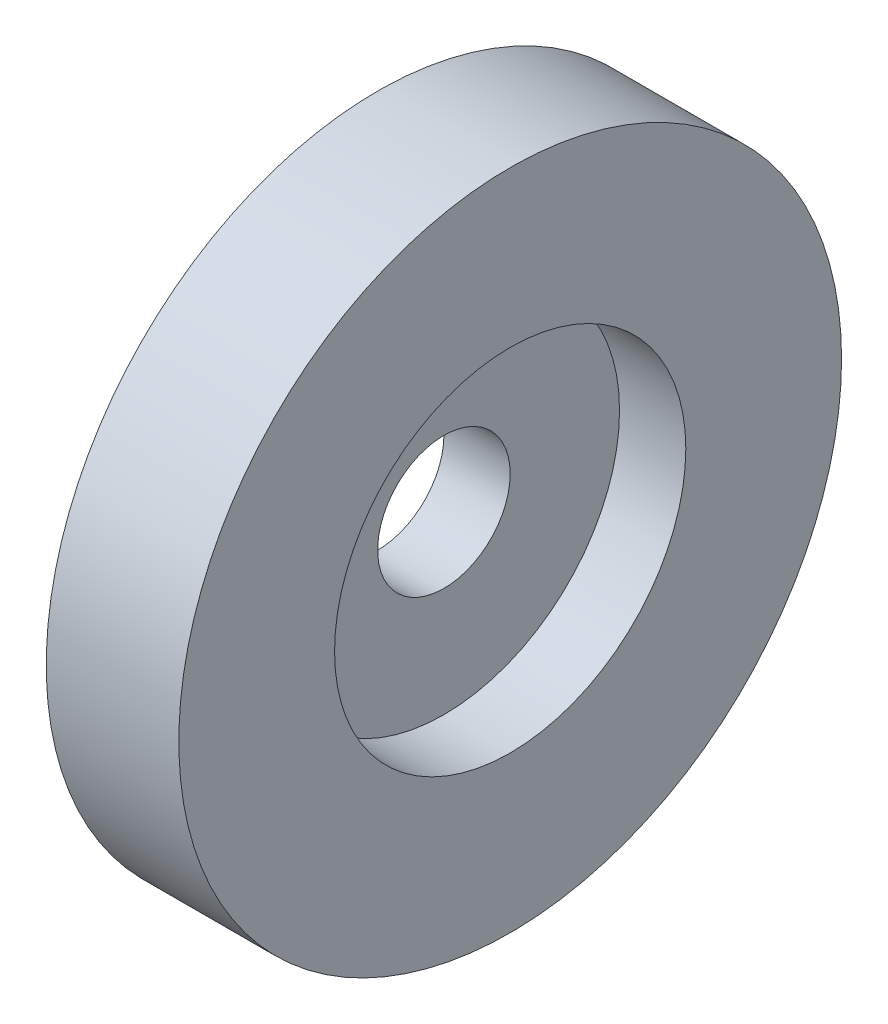
ISO-10303-21;
HEADER;
FILE_DESCRIPTION(('STEP AP214'),'2;1');
FILE_NAME('part.step','',(''),(''),'','','');
FILE_SCHEMA(('AUTOMOTIVE_DESIGN { 1 0 10303 214 1 1 1 1 }'));
ENDSEC;
DATA;
#1=APPLICATION_CONTEXT('core data for automotive mechanical design processes');
#2=APPLICATION_PROTOCOL_DEFINITION('international standard','automotive_design',2000,#1);
#3=PRODUCT_CONTEXT('',#1,'mechanical');
#4=PRODUCT('Part','Part','',(#3));
#5=PRODUCT_RELATED_PRODUCT_CATEGORY('part','',(#4));
#6=PRODUCT_DEFINITION_FORMATION('','',#4);
#7=PRODUCT_DEFINITION_CONTEXT('part definition',#1,'design');
#8=PRODUCT_DEFINITION('design','',#6,#7);
#9=PRODUCT_DEFINITION_SHAPE('','',#8);
#10=(LENGTH_UNIT() NAMED_UNIT(*) SI_UNIT(.MILLI.,.METRE.));
#11=(NAMED_UNIT(*) PLANE_ANGLE_UNIT() SI_UNIT($,.RADIAN.));
#12=(NAMED_UNIT(*) SI_UNIT($,.STERADIAN.) SOLID_ANGLE_UNIT());
#13=UNCERTAINTY_MEASURE_WITH_UNIT(LENGTH_MEASURE(1.E-05),#10,'distance_accuracy_value','');
#14=(GEOMETRIC_REPRESENTATION_CONTEXT(3) GLOBAL_UNCERTAINTY_ASSIGNED_CONTEXT((#13)) GLOBAL_UNIT_ASSIGNED_CONTEXT((#10,
#11,#12)) REPRESENTATION_CONTEXT('',''));
#15=CARTESIAN_POINT('',(0.,0.,0.));
#16=DIRECTION('',(0.,0.,1.));
#17=DIRECTION('',(1.,0.,0.));
#18=AXIS2_PLACEMENT_3D('',#15,#16,#17);
#19=CARTESIAN_POINT('',(-5.65685424949238,0.,0.));
#20=DIRECTION('',(1.,0.,0.));
#21=DIRECTION('',(0.,0.,-1.));
#22=AXIS2_PLACEMENT_3D('',#19,#20,#21);
#23=CYLINDRICAL_SURFACE('',#22,2.);
#24=CARTESIAN_POINT('',(0.,0.,0.));
#25=DIRECTION('',(1.,0.,0.));
#26=DIRECTION('',(0.,0.,-1.));
#27=AXIS2_PLACEMENT_3D('',#24,#25,#26);
#28=CIRCLE('',#27,2.);
#29=CARTESIAN_POINT('',(0.,0.,-2.));
#30=VERTEX_POINT('',#29);
#31=EDGE_CURVE('E46',#30,#30,#28,.F.);
#32=CARTESIAN_POINT('',(2.,0.,0.));
#33=DIRECTION('',(1.,0.,0.));
#34=DIRECTION('',(0.,0.,-1.));
#35=AXIS2_PLACEMENT_3D('',#32,#33,#34);
#36=CIRCLE('',#35,2.);
#37=CARTESIAN_POINT('',(2.,0.,-2.));
#38=VERTEX_POINT('',#37);
#39=EDGE_CURVE('E37',#38,#38,#36,.F.);
#40=CARTESIAN_POINT('',(0.,0.,-2.));
#41=CARTESIAN_POINT('',(0.0208333333333325,0.,-2.));
#42=CARTESIAN_POINT('',(0.0416666666666658,0.,-2.));
#43=CARTESIAN_POINT('',(0.0833333333333326,0.,-2.));
#44=CARTESIAN_POINT('',(0.104166666666666,0.,-2.));
#45=CARTESIAN_POINT('',(0.145833333333333,0.,-2.));
#46=CARTESIAN_POINT('',(0.166666666666666,0.,-2.));
#47=CARTESIAN_POINT('',(0.208333333333333,0.,-2.));
#48=CARTESIAN_POINT('',(0.229166666666666,0.,-2.));
#49=CARTESIAN_POINT('',(0.270833333333333,0.,-2.));
#50=CARTESIAN_POINT('',(0.291666666666666,0.,-2.));
#51=CARTESIAN_POINT('',(0.333333333333333,0.,-2.));
#52=CARTESIAN_POINT('',(0.354166666666666,0.,-2.));
#53=CARTESIAN_POINT('',(0.395833333333333,0.,-2.));
#54=CARTESIAN_POINT('',(0.416666666666666,0.,-2.));
#55=CARTESIAN_POINT('',(0.458333333333333,0.,-2.));
#56=CARTESIAN_POINT('',(0.479166666666666,0.,-2.));
#57=CARTESIAN_POINT('',(0.520833333333333,0.,-2.));
#58=CARTESIAN_POINT('',(0.541666666666666,0.,-2.));
#59=CARTESIAN_POINT('',(0.583333333333333,0.,-2.));
#60=CARTESIAN_POINT('',(0.604166666666666,0.,-2.));
#61=CARTESIAN_POINT('',(0.645833333333332,0.,-2.));
#62=CARTESIAN_POINT('',(0.666666666666666,0.,-2.));
#63=CARTESIAN_POINT('',(0.708333333333332,0.,-2.));
#64=CARTESIAN_POINT('',(0.729166666666666,0.,-2.));
#65=CARTESIAN_POINT('',(0.770833333333332,0.,-2.));
#66=CARTESIAN_POINT('',(0.791666666666666,0.,-2.));
#67=CARTESIAN_POINT('',(0.833333333333332,0.,-2.));
#68=CARTESIAN_POINT('',(0.854166666666666,0.,-2.));
#69=CARTESIAN_POINT('',(0.895833333333332,0.,-2.));
#70=CARTESIAN_POINT('',(0.916666666666666,0.,-2.));
#71=CARTESIAN_POINT('',(0.958333333333332,0.,-2.));
#72=CARTESIAN_POINT('',(0.979166666666666,0.,-2.));
#73=CARTESIAN_POINT('',(1.02083333333333,0.,-2.));
#74=CARTESIAN_POINT('',(1.04166666666667,0.,-2.));
#75=CARTESIAN_POINT('',(1.08333333333333,0.,-2.));
#76=CARTESIAN_POINT('',(1.10416666666667,0.,-2.));
#77=CARTESIAN_POINT('',(1.14583333333333,0.,-2.));
#78=CARTESIAN_POINT('',(1.16666666666667,0.,-2.));
#79=CARTESIAN_POINT('',(1.20833333333333,0.,-2.));
#80=CARTESIAN_POINT('',(1.22916666666667,0.,-2.));
#81=CARTESIAN_POINT('',(1.27083333333333,0.,-2.));
#82=CARTESIAN_POINT('',(1.29166666666667,0.,-2.));
#83=CARTESIAN_POINT('',(1.33333333333333,0.,-2.));
#84=CARTESIAN_POINT('',(1.35416666666667,0.,-2.));
#85=CARTESIAN_POINT('',(1.39583333333333,0.,-2.));
#86=CARTESIAN_POINT('',(1.41666666666667,0.,-2.));
#87=CARTESIAN_POINT('',(1.45833333333333,0.,-2.));
#88=CARTESIAN_POINT('',(1.47916666666667,0.,-2.));
#89=CARTESIAN_POINT('',(1.52083333333333,0.,-2.));
#90=CARTESIAN_POINT('',(1.54166666666667,0.,-2.));
#91=CARTESIAN_POINT('',(1.58333333333333,0.,-2.));
#92=CARTESIAN_POINT('',(1.60416666666667,0.,-2.));
#93=CARTESIAN_POINT('',(1.64583333333333,0.,-2.));
#94=CARTESIAN_POINT('',(1.66666666666667,0.,-2.));
#95=CARTESIAN_POINT('',(1.70833333333333,0.,-2.));
#96=CARTESIAN_POINT('',(1.72916666666667,0.,-2.));
#97=CARTESIAN_POINT('',(1.77083333333333,0.,-2.));
#98=CARTESIAN_POINT('',(1.79166666666667,0.,-2.));
#99=CARTESIAN_POINT('',(1.83333333333333,0.,-2.));
#100=CARTESIAN_POINT('',(1.85416666666667,0.,-2.));
#101=CARTESIAN_POINT('',(1.89583333333333,0.,-2.));
#102=CARTESIAN_POINT('',(1.91666666666667,0.,-2.));
#103=CARTESIAN_POINT('',(1.95833333333333,0.,-2.));
#104=CARTESIAN_POINT('',(1.97916666666667,0.,-2.));
#105=CARTESIAN_POINT('',(2.,0.,-2.));
#106=B_SPLINE_CURVE_WITH_KNOTS('',3,(#40,#41,#42,#43,#44,#45,#46,#47,#48,#49,#50,#51,#52,#53,
#54,#55,#56,#57,#58,#59,#60,#61,#62,#63,#64,#65,#66,#67,#68,#69,#70,#71,#72,#73,#74,#75,#76,#77,
#78,#79,#80,#81,#82,#83,#84,#85,#86,#87,#88,#89,#90,#91,#92,#93,#94,#95,#96,#97,#98,#99,#100,
#101,#102,#103,#104,#105),.UNSPECIFIED.,.F.,.F.,(4,2,2,2,2,2,2,2,2,2,2,2,2,2,2,2,2,2,2,2,2,2,2,
2,2,2,2,2,2,2,2,2,4),(0.,0.0625000000000001,0.125,0.1875,0.25,0.3125,0.375,0.4375,0.5,0.5625,
0.625,0.6875,0.75,0.8125,0.875,0.9375,1.,1.0625,1.125,1.1875,1.25,1.3125,1.375,1.4375,1.5,
1.5625,1.625,1.6875,1.75,1.8125,1.875,1.9375,2.),.UNSPECIFIED.);
#107=EDGE_CURVE('BSEAM33',#30,#38,#106,.T.);
#108=ORIENTED_EDGE('',*,*,#31,.T.);
#109=ORIENTED_EDGE('',*,*,#39,.F.);
#110=ORIENTED_EDGE('',*,*,#107,.T.);
#111=ORIENTED_EDGE('',*,*,#107,.F.);
#112=EDGE_LOOP('',(#108,#110,#109,#111));
#113=FACE_BOUND('',#112,.T.);
#114=ADVANCED_FACE('F33',(#113),#23,.F.);
#115=CARTESIAN_POINT('',(4.,0.,0.));
#116=DIRECTION('',(-1.,0.,0.));
#117=DIRECTION('',(0.,0.,1.));
#118=AXIS2_PLACEMENT_3D('',#115,#116,#117);
#119=CYLINDRICAL_SURFACE('',#118,10.);
#120=CARTESIAN_POINT('',(4.,0.,0.));
#121=DIRECTION('',(1.,0.,0.));
#122=DIRECTION('',(0.,0.,-1.));
#123=AXIS2_PLACEMENT_3D('',#120,#121,#122);
#124=CIRCLE('',#123,10.);
#125=CARTESIAN_POINT('',(4.,0.,-10.));
#126=VERTEX_POINT('',#125);
#127=EDGE_CURVE('E10',#126,#126,#124,.T.);
#128=ORIENTED_EDGE('',*,*,#127,.F.);
#129=EDGE_LOOP('',(#128));
#130=FACE_BOUND('',#129,.T.);
#131=CARTESIAN_POINT('',(0.,0.,0.));
#132=DIRECTION('',(1.,0.,0.));
#133=DIRECTION('',(0.,0.,-1.));
#134=AXIS2_PLACEMENT_3D('',#131,#132,#133);
#135=CIRCLE('',#134,10.);
#136=CARTESIAN_POINT('',(0.,0.,-10.));
#137=VERTEX_POINT('',#136);
#138=EDGE_CURVE('E41',#137,#137,#135,.T.);
#139=ORIENTED_EDGE('',*,*,#138,.T.);
#140=EDGE_LOOP('',(#139));
#141=FACE_BOUND('',#140,.T.);
#142=ADVANCED_FACE('F35',(#130,#141),#119,.T.);
#143=CARTESIAN_POINT('',(4.,0.,0.));
#144=DIRECTION('',(1.,0.,0.));
#145=DIRECTION('',(0.,0.,-1.));
#146=AXIS2_PLACEMENT_3D('',#143,#144,#145);
#147=PLANE('',#146);
#148=CARTESIAN_POINT('',(4.,0.,0.));
#149=DIRECTION('',(1.,0.,0.));
#150=DIRECTION('',(0.,0.,-1.));
#151=AXIS2_PLACEMENT_3D('',#148,#149,#150);
#152=CIRCLE('',#151,5.3);
#153=CARTESIAN_POINT('',(4.,0.,-5.3));
#154=VERTEX_POINT('',#153);
#155=EDGE_CURVE('E50',#154,#154,#152,.T.);
#156=ORIENTED_EDGE('',*,*,#155,.F.);
#157=EDGE_LOOP('',(#156));
#158=FACE_BOUND('',#157,.T.);
#159=ORIENTED_EDGE('',*,*,#127,.T.);
#160=EDGE_LOOP('',(#159));
#161=FACE_BOUND('',#160,.T.);
#162=ADVANCED_FACE('F68',(#158,#161),#147,.T.);
#163=CARTESIAN_POINT('',(0.,0.,0.));
#164=DIRECTION('',(1.,0.,0.));
#165=DIRECTION('',(0.,0.,-1.));
#166=AXIS2_PLACEMENT_3D('',#163,#164,#165);
#167=PLANE('',#166);
#168=ORIENTED_EDGE('',*,*,#31,.F.);
#169=EDGE_LOOP('',(#168));
#170=FACE_BOUND('',#169,.T.);
#171=ORIENTED_EDGE('',*,*,#138,.F.);
#172=EDGE_LOOP('',(#171));
#173=FACE_BOUND('',#172,.T.);
#174=ADVANCED_FACE('F75',(#170,#173),#167,.F.);
#175=CARTESIAN_POINT('',(2.,0.,0.));
#176=DIRECTION('',(1.,0.,0.));
#177=DIRECTION('',(0.,0.,-1.));
#178=AXIS2_PLACEMENT_3D('',#175,#176,#177);
#179=PLANE('',#178);
#180=CARTESIAN_POINT('',(2.,0.,0.));
#181=DIRECTION('',(1.,0.,0.));
#182=DIRECTION('',(0.,0.,-1.));
#183=AXIS2_PLACEMENT_3D('',#180,#181,#182);
#184=CIRCLE('',#183,5.3);
#185=CARTESIAN_POINT('',(2.,0.,-5.3));
#186=VERTEX_POINT('',#185);
#187=EDGE_CURVE('E53',#186,#186,#184,.T.);
#188=ORIENTED_EDGE('',*,*,#187,.T.);
#189=EDGE_LOOP('',(#188));
#190=FACE_BOUND('',#189,.T.);
#191=ORIENTED_EDGE('',*,*,#39,.T.);
#192=EDGE_LOOP('',(#191));
#193=FACE_BOUND('',#192,.T.);
#194=ADVANCED_FACE('F60',(#190,#193),#179,.T.);
#195=CARTESIAN_POINT('',(2.,0.,0.));
#196=DIRECTION('',(1.,0.,0.));
#197=DIRECTION('',(0.,0.,-1.));
#198=AXIS2_PLACEMENT_3D('',#195,#196,#197);
#199=CYLINDRICAL_SURFACE('',#198,5.3);
#200=ORIENTED_EDGE('',*,*,#187,.F.);
#201=EDGE_LOOP('',(#200));
#202=FACE_BOUND('',#201,.T.);
#203=ORIENTED_EDGE('',*,*,#155,.T.);
#204=EDGE_LOOP('',(#203));
#205=FACE_BOUND('',#204,.T.);
#206=ADVANCED_FACE('F72',(#202,#205),#199,.F.);
#207=CLOSED_SHELL('',(#114,#142,#162,#174,#194,#206));
#208=MANIFOLD_SOLID_BREP('B2',#207);
#209=ADVANCED_BREP_SHAPE_REPRESENTATION('',(#18,#208),#14);
#210=SHAPE_DEFINITION_REPRESENTATION(#9,#209);
ENDSEC;
END-ISO-10303-21;
